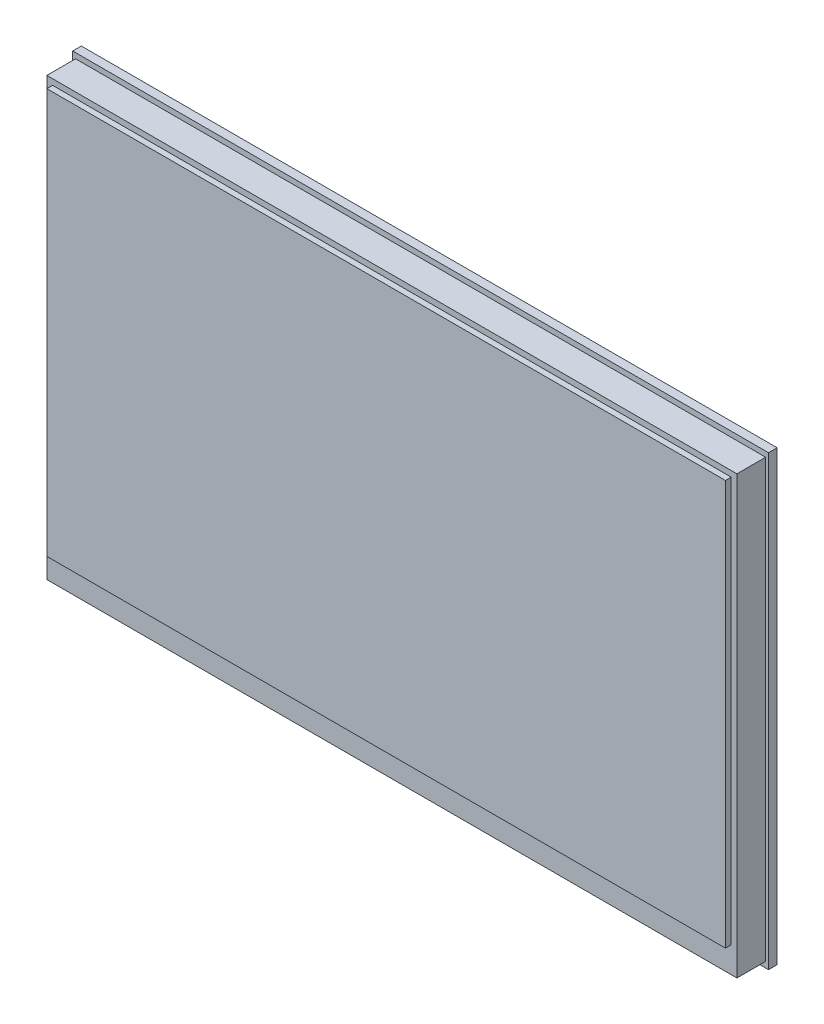
ISO-10303-21;
HEADER;
FILE_DESCRIPTION(('STEP AP214'),'2;1');
FILE_NAME('part.step','',(''),(''),'','','');
FILE_SCHEMA(('AUTOMOTIVE_DESIGN { 1 0 10303 214 1 1 1 1 }'));
ENDSEC;
DATA;
#1=APPLICATION_CONTEXT('core data for automotive mechanical design processes');
#2=APPLICATION_PROTOCOL_DEFINITION('international standard','automotive_design',2000,#1);
#3=PRODUCT_CONTEXT('',#1,'mechanical');
#4=PRODUCT('Part','Part','',(#3));
#5=PRODUCT_RELATED_PRODUCT_CATEGORY('part','',(#4));
#6=PRODUCT_DEFINITION_FORMATION('','',#4);
#7=PRODUCT_DEFINITION_CONTEXT('part definition',#1,'design');
#8=PRODUCT_DEFINITION('design','',#6,#7);
#9=PRODUCT_DEFINITION_SHAPE('','',#8);
#10=(LENGTH_UNIT() NAMED_UNIT(*) SI_UNIT(.MILLI.,.METRE.));
#11=(NAMED_UNIT(*) PLANE_ANGLE_UNIT() SI_UNIT($,.RADIAN.));
#12=(NAMED_UNIT(*) SI_UNIT($,.STERADIAN.) SOLID_ANGLE_UNIT());
#13=UNCERTAINTY_MEASURE_WITH_UNIT(LENGTH_MEASURE(1.E-05),#10,'distance_accuracy_value','');
#14=(GEOMETRIC_REPRESENTATION_CONTEXT(3) GLOBAL_UNCERTAINTY_ASSIGNED_CONTEXT((#13)) GLOBAL_UNIT_ASSIGNED_CONTEXT((#10,
#11,#12)) REPRESENTATION_CONTEXT('',''));
#15=CARTESIAN_POINT('',(0.,0.,0.));
#16=DIRECTION('',(0.,0.,1.));
#17=DIRECTION('',(1.,0.,0.));
#18=AXIS2_PLACEMENT_3D('',#15,#16,#17);
#19=CARTESIAN_POINT('',(0.,0.,6.5));
#20=DIRECTION('',(0.,0.,-1.));
#21=DIRECTION('',(-1.,0.,0.));
#22=AXIS2_PLACEMENT_3D('',#19,#20,#21);
#23=PLANE('',#22);
#24=DIRECTION('',(0.,-1.,0.));
#25=VECTOR('',#24,1.);
#26=CARTESIAN_POINT('',(0.5,1.,6.5));
#27=LINE('',#26,#25);
#28=CARTESIAN_POINT('',(0.5,77.,6.5));
#29=VERTEX_POINT('',#28);
#30=CARTESIAN_POINT('',(0.5,1.,6.5));
#31=VERTEX_POINT('',#30);
#32=EDGE_CURVE('E156',#29,#31,#27,.T.);
#33=ORIENTED_EDGE('',*,*,#32,.T.);
#34=DIRECTION('',(1.,0.,0.));
#35=VECTOR('',#34,1.);
#36=CARTESIAN_POINT('',(0.5,1.,6.5));
#37=LINE('',#36,#35);
#38=CARTESIAN_POINT('',(120.61,1.,6.5));
#39=VERTEX_POINT('',#38);
#40=EDGE_CURVE('E159',#31,#39,#37,.T.);
#41=ORIENTED_EDGE('',*,*,#40,.T.);
#42=DIRECTION('',(0.,1.,0.));
#43=VECTOR('',#42,1.);
#44=CARTESIAN_POINT('',(120.61,1.,6.5));
#45=LINE('',#44,#43);
#46=CARTESIAN_POINT('',(120.61,77.,6.5));
#47=VERTEX_POINT('',#46);
#48=EDGE_CURVE('E162',#39,#47,#45,.T.);
#49=ORIENTED_EDGE('',*,*,#48,.T.);
#50=DIRECTION('',(-1.,0.,0.));
#51=VECTOR('',#50,1.);
#52=CARTESIAN_POINT('',(0.5,77.,6.5));
#53=LINE('',#52,#51);
#54=EDGE_CURVE('E164',#47,#29,#53,.T.);
#55=ORIENTED_EDGE('',*,*,#54,.T.);
#56=EDGE_LOOP('',(#33,#41,#49,#55));
#57=FACE_BOUND('',#56,.T.);
#58=DIRECTION('',(0.,-1.,0.));
#59=VECTOR('',#58,1.);
#60=CARTESIAN_POINT('',(1.5,5.5,6.5));
#61=LINE('',#60,#59);
#62=CARTESIAN_POINT('',(1.5,76.,6.5));
#63=VERTEX_POINT('',#62);
#64=CARTESIAN_POINT('',(1.5,5.5,6.5));
#65=VERTEX_POINT('',#64);
#66=EDGE_CURVE('E146',#63,#65,#61,.T.);
#67=ORIENTED_EDGE('',*,*,#66,.F.);
#68=DIRECTION('',(-1.,0.,0.));
#69=VECTOR('',#68,1.);
#70=CARTESIAN_POINT('',(1.5,76.,6.5));
#71=LINE('',#70,#69);
#72=CARTESIAN_POINT('',(119.61,76.,6.5));
#73=VERTEX_POINT('',#72);
#74=EDGE_CURVE('E143',#73,#63,#71,.T.);
#75=ORIENTED_EDGE('',*,*,#74,.F.);
#76=DIRECTION('',(0.,1.,0.));
#77=VECTOR('',#76,1.);
#78=CARTESIAN_POINT('',(119.61,5.5,6.5));
#79=LINE('',#78,#77);
#80=CARTESIAN_POINT('',(119.61,5.5,6.5));
#81=VERTEX_POINT('',#80);
#82=EDGE_CURVE('E57',#81,#73,#79,.T.);
#83=ORIENTED_EDGE('',*,*,#82,.F.);
#84=DIRECTION('',(1.,0.,0.));
#85=VECTOR('',#84,1.);
#86=CARTESIAN_POINT('',(1.5,5.5,6.5));
#87=LINE('',#86,#85);
#88=EDGE_CURVE('E52',#65,#81,#87,.T.);
#89=ORIENTED_EDGE('',*,*,#88,.F.);
#90=EDGE_LOOP('',(#67,#75,#83,#89));
#91=FACE_BOUND('',#90,.T.);
#92=ADVANCED_FACE('F37',(#57,#91),#23,.F.);
#93=CARTESIAN_POINT('',(0.,0.,1.5));
#94=DIRECTION('',(0.,0.,-1.));
#95=DIRECTION('',(-1.,0.,0.));
#96=AXIS2_PLACEMENT_3D('',#93,#94,#95);
#97=PLANE('',#96);
#98=DIRECTION('',(0.,-1.,0.));
#99=VECTOR('',#98,1.);
#100=CARTESIAN_POINT('',(0.,0.,1.5));
#101=LINE('',#100,#99);
#102=CARTESIAN_POINT('',(0.,77.93,1.5));
#103=VERTEX_POINT('',#102);
#104=CARTESIAN_POINT('',(0.,0.,1.5));
#105=VERTEX_POINT('',#104);
#106=EDGE_CURVE('E210',#103,#105,#101,.T.);
#107=ORIENTED_EDGE('',*,*,#106,.T.);
#108=DIRECTION('',(1.,0.,0.));
#109=VECTOR('',#108,1.);
#110=CARTESIAN_POINT('',(0.,0.,1.5));
#111=LINE('',#110,#109);
#112=CARTESIAN_POINT('',(121.11,0.,1.5));
#113=VERTEX_POINT('',#112);
#114=EDGE_CURVE('E213',#105,#113,#111,.T.);
#115=ORIENTED_EDGE('',*,*,#114,.T.);
#116=DIRECTION('',(0.,1.,0.));
#117=VECTOR('',#116,1.);
#118=CARTESIAN_POINT('',(121.11,0.,1.5));
#119=LINE('',#118,#117);
#120=CARTESIAN_POINT('',(121.11,77.93,1.5));
#121=VERTEX_POINT('',#120);
#122=EDGE_CURVE('E216',#113,#121,#119,.T.);
#123=ORIENTED_EDGE('',*,*,#122,.T.);
#124=DIRECTION('',(-1.,0.,0.));
#125=VECTOR('',#124,1.);
#126=CARTESIAN_POINT('',(0.,77.93,1.5));
#127=LINE('',#126,#125);
#128=EDGE_CURVE('E218',#121,#103,#127,.T.);
#129=ORIENTED_EDGE('',*,*,#128,.T.);
#130=EDGE_LOOP('',(#107,#115,#123,#129));
#131=FACE_BOUND('',#130,.T.);
#132=DIRECTION('',(0.,-1.,0.));
#133=VECTOR('',#132,1.);
#134=CARTESIAN_POINT('',(0.5,1.,1.5));
#135=LINE('',#134,#133);
#136=CARTESIAN_POINT('',(0.5,77.,1.5));
#137=VERTEX_POINT('',#136);
#138=CARTESIAN_POINT('',(0.5,1.,1.5));
#139=VERTEX_POINT('',#138);
#140=EDGE_CURVE('E147',#137,#139,#135,.T.);
#141=ORIENTED_EDGE('',*,*,#140,.F.);
#142=DIRECTION('',(-1.,0.,0.));
#143=VECTOR('',#142,1.);
#144=CARTESIAN_POINT('',(0.5,77.,1.5));
#145=LINE('',#144,#143);
#146=CARTESIAN_POINT('',(120.61,77.,1.5));
#147=VERTEX_POINT('',#146);
#148=EDGE_CURVE('E160',#147,#137,#145,.T.);
#149=ORIENTED_EDGE('',*,*,#148,.F.);
#150=DIRECTION('',(0.,1.,0.));
#151=VECTOR('',#150,1.);
#152=CARTESIAN_POINT('',(120.61,1.,1.5));
#153=LINE('',#152,#151);
#154=CARTESIAN_POINT('',(120.61,1.,1.5));
#155=VERTEX_POINT('',#154);
#156=EDGE_CURVE('E169',#155,#147,#153,.T.);
#157=ORIENTED_EDGE('',*,*,#156,.F.);
#158=DIRECTION('',(1.,0.,0.));
#159=VECTOR('',#158,1.);
#160=CARTESIAN_POINT('',(0.5,1.,1.5));
#161=LINE('',#160,#159);
#162=EDGE_CURVE('E150',#139,#155,#161,.T.);
#163=ORIENTED_EDGE('',*,*,#162,.F.);
#164=EDGE_LOOP('',(#141,#149,#157,#163));
#165=FACE_BOUND('',#164,.T.);
#166=ADVANCED_FACE('F252',(#131,#165),#97,.F.);
#167=CARTESIAN_POINT('',(0.,0.,1.5));
#168=DIRECTION('',(1.,0.,0.));
#169=DIRECTION('',(0.,0.,-1.));
#170=AXIS2_PLACEMENT_3D('',#167,#168,#169);
#171=PLANE('',#170);
#172=DIRECTION('',(0.,-1.,0.));
#173=VECTOR('',#172,1.);
#174=CARTESIAN_POINT('',(0.,0.,0.));
#175=LINE('',#174,#173);
#176=CARTESIAN_POINT('',(0.,77.93,0.));
#177=VERTEX_POINT('',#176);
#178=CARTESIAN_POINT('',(0.,0.,0.));
#179=VERTEX_POINT('',#178);
#180=EDGE_CURVE('E209',#177,#179,#175,.T.);
#181=ORIENTED_EDGE('',*,*,#180,.T.);
#182=DIRECTION('',(0.,0.,-1.));
#183=VECTOR('',#182,1.);
#184=CARTESIAN_POINT('',(0.,0.,1.5));
#185=LINE('',#184,#183);
#186=EDGE_CURVE('E11',#105,#179,#185,.T.);
#187=ORIENTED_EDGE('',*,*,#186,.F.);
#188=ORIENTED_EDGE('',*,*,#106,.F.);
#189=DIRECTION('',(0.,0.,-1.));
#190=VECTOR('',#189,1.);
#191=CARTESIAN_POINT('',(0.,77.93,1.5));
#192=LINE('',#191,#190);
#193=EDGE_CURVE('E220',#103,#177,#192,.T.);
#194=ORIENTED_EDGE('',*,*,#193,.T.);
#195=EDGE_LOOP('',(#181,#187,#188,#194));
#196=FACE_BOUND('',#195,.T.);
#197=ADVANCED_FACE('F39',(#196),#171,.F.);
#198=CARTESIAN_POINT('',(0.,0.,1.5));
#199=DIRECTION('',(0.,1.,0.));
#200=DIRECTION('',(0.,0.,1.));
#201=AXIS2_PLACEMENT_3D('',#198,#199,#200);
#202=PLANE('',#201);
#203=DIRECTION('',(1.,0.,0.));
#204=VECTOR('',#203,1.);
#205=CARTESIAN_POINT('',(0.,0.,0.));
#206=LINE('',#205,#204);
#207=CARTESIAN_POINT('',(121.11,0.,0.));
#208=VERTEX_POINT('',#207);
#209=EDGE_CURVE('E223',#179,#208,#206,.T.);
#210=ORIENTED_EDGE('',*,*,#209,.T.);
#211=DIRECTION('',(0.,0.,-1.));
#212=VECTOR('',#211,1.);
#213=CARTESIAN_POINT('',(121.11,0.,1.5));
#214=LINE('',#213,#212);
#215=EDGE_CURVE('E45',#113,#208,#214,.T.);
#216=ORIENTED_EDGE('',*,*,#215,.F.);
#217=ORIENTED_EDGE('',*,*,#114,.F.);
#218=ORIENTED_EDGE('',*,*,#186,.T.);
#219=EDGE_LOOP('',(#210,#216,#217,#218));
#220=FACE_BOUND('',#219,.T.);
#221=ADVANCED_FACE('F254',(#220),#202,.F.);
#222=CARTESIAN_POINT('',(121.11,0.,1.5));
#223=DIRECTION('',(-1.,0.,0.));
#224=DIRECTION('',(0.,0.,1.));
#225=AXIS2_PLACEMENT_3D('',#222,#223,#224);
#226=PLANE('',#225);
#227=DIRECTION('',(0.,1.,0.));
#228=VECTOR('',#227,1.);
#229=CARTESIAN_POINT('',(121.11,0.,0.));
#230=LINE('',#229,#228);
#231=CARTESIAN_POINT('',(121.11,77.93,0.));
#232=VERTEX_POINT('',#231);
#233=EDGE_CURVE('E225',#208,#232,#230,.T.);
#234=ORIENTED_EDGE('',*,*,#233,.T.);
#235=DIRECTION('',(0.,0.,-1.));
#236=VECTOR('',#235,1.);
#237=CARTESIAN_POINT('',(121.11,77.93,1.5));
#238=LINE('',#237,#236);
#239=EDGE_CURVE('E230',#121,#232,#238,.T.);
#240=ORIENTED_EDGE('',*,*,#239,.F.);
#241=ORIENTED_EDGE('',*,*,#122,.F.);
#242=ORIENTED_EDGE('',*,*,#215,.T.);
#243=EDGE_LOOP('',(#234,#240,#241,#242));
#244=FACE_BOUND('',#243,.T.);
#245=ADVANCED_FACE('F237',(#244),#226,.F.);
#246=CARTESIAN_POINT('',(0.,77.93,1.5));
#247=DIRECTION('',(0.,-1.,0.));
#248=DIRECTION('',(0.,0.,-1.));
#249=AXIS2_PLACEMENT_3D('',#246,#247,#248);
#250=PLANE('',#249);
#251=DIRECTION('',(-1.,0.,0.));
#252=VECTOR('',#251,1.);
#253=CARTESIAN_POINT('',(0.,77.93,0.));
#254=LINE('',#253,#252);
#255=EDGE_CURVE('E214',#232,#177,#254,.T.);
#256=ORIENTED_EDGE('',*,*,#255,.T.);
#257=ORIENTED_EDGE('',*,*,#193,.F.);
#258=ORIENTED_EDGE('',*,*,#128,.F.);
#259=ORIENTED_EDGE('',*,*,#239,.T.);
#260=EDGE_LOOP('',(#256,#257,#258,#259));
#261=FACE_BOUND('',#260,.T.);
#262=ADVANCED_FACE('F246',(#261),#250,.F.);
#263=CARTESIAN_POINT('',(0.,0.,0.));
#264=DIRECTION('',(0.,0.,-1.));
#265=DIRECTION('',(-1.,0.,0.));
#266=AXIS2_PLACEMENT_3D('',#263,#264,#265);
#267=PLANE('',#266);
#268=CARTESIAN_POINT('',(23.02,74.29,0.));
#269=DIRECTION('',(0.,0.,1.));
#270=DIRECTION('',(1.,0.,0.));
#271=AXIS2_PLACEMENT_3D('',#268,#269,#270);
#272=CIRCLE('',#271,0.999999999999945);
#273=CARTESIAN_POINT('',(24.0199999999999,74.29,0.));
#274=VERTEX_POINT('',#273);
#275=EDGE_CURVE('E197',#274,#274,#272,.T.);
#276=ORIENTED_EDGE('',*,*,#275,.T.);
#277=EDGE_LOOP('',(#276));
#278=FACE_BOUND('',#277,.T.);
#279=CARTESIAN_POINT('',(23.02,5.,0.));
#280=DIRECTION('',(0.,0.,1.));
#281=DIRECTION('',(1.,0.,0.));
#282=AXIS2_PLACEMENT_3D('',#279,#280,#281);
#283=CIRCLE('',#282,0.999999999999945);
#284=CARTESIAN_POINT('',(24.0199999999999,5.,0.));
#285=VERTEX_POINT('',#284);
#286=EDGE_CURVE('E200',#285,#285,#283,.T.);
#287=ORIENTED_EDGE('',*,*,#286,.T.);
#288=EDGE_LOOP('',(#287));
#289=FACE_BOUND('',#288,.T.);
#290=CARTESIAN_POINT('',(116.11,74.29,0.));
#291=DIRECTION('',(0.,0.,1.));
#292=DIRECTION('',(1.,0.,0.));
#293=AXIS2_PLACEMENT_3D('',#290,#291,#292);
#294=CIRCLE('',#293,0.999999999999945);
#295=CARTESIAN_POINT('',(117.11,74.29,0.));
#296=VERTEX_POINT('',#295);
#297=EDGE_CURVE('E203',#296,#296,#294,.T.);
#298=ORIENTED_EDGE('',*,*,#297,.T.);
#299=EDGE_LOOP('',(#298));
#300=FACE_BOUND('',#299,.T.);
#301=CARTESIAN_POINT('',(116.11,5.,0.));
#302=DIRECTION('',(0.,0.,1.));
#303=DIRECTION('',(1.,0.,0.));
#304=AXIS2_PLACEMENT_3D('',#301,#302,#303);
#305=CIRCLE('',#304,0.999999999999945);
#306=CARTESIAN_POINT('',(117.11,5.,0.));
#307=VERTEX_POINT('',#306);
#308=EDGE_CURVE('E206',#307,#307,#305,.T.);
#309=ORIENTED_EDGE('',*,*,#308,.T.);
#310=EDGE_LOOP('',(#309));
#311=FACE_BOUND('',#310,.T.);
#312=ORIENTED_EDGE('',*,*,#180,.F.);
#313=ORIENTED_EDGE('',*,*,#255,.F.);
#314=ORIENTED_EDGE('',*,*,#233,.F.);
#315=ORIENTED_EDGE('',*,*,#209,.F.);
#316=EDGE_LOOP('',(#312,#313,#314,#315));
#317=FACE_BOUND('',#316,.T.);
#318=ADVANCED_FACE('F243',(#278,#289,#300,#311,#317),#267,.T.);
#319=CARTESIAN_POINT('',(116.11,5.,1.5));
#320=DIRECTION('',(0.,0.,1.));
#321=DIRECTION('',(1.,0.,0.));
#322=AXIS2_PLACEMENT_3D('',#319,#320,#321);
#323=CYLINDRICAL_SURFACE('',#322,0.999999999999945);
#324=ORIENTED_EDGE('',*,*,#308,.F.);
#325=EDGE_LOOP('',(#324));
#326=FACE_BOUND('',#325,.T.);
#327=CARTESIAN_POINT('',(116.11,5.,1.5));
#328=DIRECTION('',(0.,0.,-1.));
#329=DIRECTION('',(-1.,0.,0.));
#330=AXIS2_PLACEMENT_3D('',#327,#328,#329);
#331=CIRCLE('',#330,0.999999999999945);
#332=CARTESIAN_POINT('',(115.11,5.,1.5));
#333=VERTEX_POINT('',#332);
#334=EDGE_CURVE('E194',#333,#333,#331,.F.);
#335=ORIENTED_EDGE('',*,*,#334,.T.);
#336=EDGE_LOOP('',(#335));
#337=FACE_BOUND('',#336,.T.);
#338=ADVANCED_FACE('F304',(#326,#337),#323,.F.);
#339=CARTESIAN_POINT('',(116.11,74.29,1.5));
#340=DIRECTION('',(0.,0.,1.));
#341=DIRECTION('',(1.,0.,0.));
#342=AXIS2_PLACEMENT_3D('',#339,#340,#341);
#343=CYLINDRICAL_SURFACE('',#342,0.999999999999945);
#344=ORIENTED_EDGE('',*,*,#297,.F.);
#345=EDGE_LOOP('',(#344));
#346=FACE_BOUND('',#345,.T.);
#347=CARTESIAN_POINT('',(116.11,74.29,1.5));
#348=DIRECTION('',(0.,0.,-1.));
#349=DIRECTION('',(-1.,0.,0.));
#350=AXIS2_PLACEMENT_3D('',#347,#348,#349);
#351=CIRCLE('',#350,0.999999999999945);
#352=CARTESIAN_POINT('',(115.11,74.29,1.5));
#353=VERTEX_POINT('',#352);
#354=EDGE_CURVE('E191',#353,#353,#351,.F.);
#355=ORIENTED_EDGE('',*,*,#354,.T.);
#356=EDGE_LOOP('',(#355));
#357=FACE_BOUND('',#356,.T.);
#358=ADVANCED_FACE('F300',(#346,#357),#343,.F.);
#359=CARTESIAN_POINT('',(23.02,5.,1.5));
#360=DIRECTION('',(0.,0.,1.));
#361=DIRECTION('',(1.,0.,0.));
#362=AXIS2_PLACEMENT_3D('',#359,#360,#361);
#363=CYLINDRICAL_SURFACE('',#362,0.999999999999945);
#364=ORIENTED_EDGE('',*,*,#286,.F.);
#365=EDGE_LOOP('',(#364));
#366=FACE_BOUND('',#365,.T.);
#367=CARTESIAN_POINT('',(23.02,5.,1.5));
#368=DIRECTION('',(0.,0.,-1.));
#369=DIRECTION('',(-1.,0.,0.));
#370=AXIS2_PLACEMENT_3D('',#367,#368,#369);
#371=CIRCLE('',#370,0.999999999999945);
#372=CARTESIAN_POINT('',(22.02,5.,1.5));
#373=VERTEX_POINT('',#372);
#374=EDGE_CURVE('E188',#373,#373,#371,.F.);
#375=ORIENTED_EDGE('',*,*,#374,.T.);
#376=EDGE_LOOP('',(#375));
#377=FACE_BOUND('',#376,.T.);
#378=ADVANCED_FACE('F296',(#366,#377),#363,.F.);
#379=CARTESIAN_POINT('',(23.02,74.29,1.5));
#380=DIRECTION('',(0.,0.,1.));
#381=DIRECTION('',(1.,0.,0.));
#382=AXIS2_PLACEMENT_3D('',#379,#380,#381);
#383=CYLINDRICAL_SURFACE('',#382,0.999999999999945);
#384=ORIENTED_EDGE('',*,*,#275,.F.);
#385=EDGE_LOOP('',(#384));
#386=FACE_BOUND('',#385,.T.);
#387=CARTESIAN_POINT('',(23.02,74.29,1.5));
#388=DIRECTION('',(0.,0.,-1.));
#389=DIRECTION('',(-1.,0.,0.));
#390=AXIS2_PLACEMENT_3D('',#387,#388,#389);
#391=CIRCLE('',#390,0.999999999999945);
#392=CARTESIAN_POINT('',(22.02,74.29,1.5));
#393=VERTEX_POINT('',#392);
#394=EDGE_CURVE('E185',#393,#393,#391,.F.);
#395=ORIENTED_EDGE('',*,*,#394,.T.);
#396=EDGE_LOOP('',(#395));
#397=FACE_BOUND('',#396,.T.);
#398=ADVANCED_FACE('F293',(#386,#397),#383,.F.);
#399=CARTESIAN_POINT('',(0.,0.,1.5));
#400=DIRECTION('',(0.,0.,-1.));
#401=DIRECTION('',(-1.,0.,0.));
#402=AXIS2_PLACEMENT_3D('',#399,#400,#401);
#403=PLANE('',#402);
#404=ORIENTED_EDGE('',*,*,#394,.F.);
#405=EDGE_LOOP('',(#404));
#406=FACE_BOUND('',#405,.T.);
#407=ADVANCED_FACE('F277',(#406),#403,.T.);
#408=ORIENTED_EDGE('',*,*,#374,.F.);
#409=EDGE_LOOP('',(#408));
#410=FACE_BOUND('',#409,.T.);
#411=ADVANCED_FACE('F344',(#410),#403,.T.);
#412=ORIENTED_EDGE('',*,*,#354,.F.);
#413=EDGE_LOOP('',(#412));
#414=FACE_BOUND('',#413,.T.);
#415=ADVANCED_FACE('F275',(#414),#403,.T.);
#416=ORIENTED_EDGE('',*,*,#334,.F.);
#417=EDGE_LOOP('',(#416));
#418=FACE_BOUND('',#417,.T.);
#419=ADVANCED_FACE('F271',(#418),#403,.T.);
#420=CARTESIAN_POINT('',(0.5,1.,6.5));
#421=DIRECTION('',(1.,0.,0.));
#422=DIRECTION('',(0.,0.,-1.));
#423=AXIS2_PLACEMENT_3D('',#420,#421,#422);
#424=PLANE('',#423);
#425=ORIENTED_EDGE('',*,*,#140,.T.);
#426=DIRECTION('',(0.,0.,-1.));
#427=VECTOR('',#426,1.);
#428=CARTESIAN_POINT('',(0.5,1.,6.5));
#429=LINE('',#428,#427);
#430=EDGE_CURVE('E182',#31,#139,#429,.T.);
#431=ORIENTED_EDGE('',*,*,#430,.F.);
#432=ORIENTED_EDGE('',*,*,#32,.F.);
#433=DIRECTION('',(0.,0.,-1.));
#434=VECTOR('',#433,1.);
#435=CARTESIAN_POINT('',(0.5,77.,6.5));
#436=LINE('',#435,#434);
#437=EDGE_CURVE('E165',#29,#137,#436,.T.);
#438=ORIENTED_EDGE('',*,*,#437,.T.);
#439=EDGE_LOOP('',(#425,#431,#432,#438));
#440=FACE_BOUND('',#439,.T.);
#441=ADVANCED_FACE('F274',(#440),#424,.F.);
#442=CARTESIAN_POINT('',(0.5,1.,6.5));
#443=DIRECTION('',(0.,1.,0.));
#444=DIRECTION('',(0.,0.,1.));
#445=AXIS2_PLACEMENT_3D('',#442,#443,#444);
#446=PLANE('',#445);
#447=ORIENTED_EDGE('',*,*,#162,.T.);
#448=DIRECTION('',(0.,0.,-1.));
#449=VECTOR('',#448,1.);
#450=CARTESIAN_POINT('',(120.61,1.,6.5));
#451=LINE('',#450,#449);
#452=EDGE_CURVE('E179',#39,#155,#451,.T.);
#453=ORIENTED_EDGE('',*,*,#452,.F.);
#454=ORIENTED_EDGE('',*,*,#40,.F.);
#455=ORIENTED_EDGE('',*,*,#430,.T.);
#456=EDGE_LOOP('',(#447,#453,#454,#455));
#457=FACE_BOUND('',#456,.T.);
#458=ADVANCED_FACE('F285',(#457),#446,.F.);
#459=CARTESIAN_POINT('',(120.61,1.,6.5));
#460=DIRECTION('',(-1.,0.,0.));
#461=DIRECTION('',(0.,0.,1.));
#462=AXIS2_PLACEMENT_3D('',#459,#460,#461);
#463=PLANE('',#462);
#464=ORIENTED_EDGE('',*,*,#156,.T.);
#465=DIRECTION('',(0.,0.,-1.));
#466=VECTOR('',#465,1.);
#467=CARTESIAN_POINT('',(120.61,77.,6.5));
#468=LINE('',#467,#466);
#469=EDGE_CURVE('E176',#47,#147,#468,.T.);
#470=ORIENTED_EDGE('',*,*,#469,.F.);
#471=ORIENTED_EDGE('',*,*,#48,.F.);
#472=ORIENTED_EDGE('',*,*,#452,.T.);
#473=EDGE_LOOP('',(#464,#470,#471,#472));
#474=FACE_BOUND('',#473,.T.);
#475=ADVANCED_FACE('F281',(#474),#463,.F.);
#476=CARTESIAN_POINT('',(0.5,77.,6.5));
#477=DIRECTION('',(0.,-1.,0.));
#478=DIRECTION('',(0.,0.,-1.));
#479=AXIS2_PLACEMENT_3D('',#476,#477,#478);
#480=PLANE('',#479);
#481=ORIENTED_EDGE('',*,*,#148,.T.);
#482=ORIENTED_EDGE('',*,*,#437,.F.);
#483=ORIENTED_EDGE('',*,*,#54,.F.);
#484=ORIENTED_EDGE('',*,*,#469,.T.);
#485=EDGE_LOOP('',(#481,#482,#483,#484));
#486=FACE_BOUND('',#485,.T.);
#487=ADVANCED_FACE('F278',(#486),#480,.F.);
#488=CARTESIAN_POINT('',(1.5,5.5,7.5));
#489=DIRECTION('',(1.,0.,0.));
#490=DIRECTION('',(0.,0.,-1.));
#491=AXIS2_PLACEMENT_3D('',#488,#489,#490);
#492=PLANE('',#491);
#493=ORIENTED_EDGE('',*,*,#66,.T.);
#494=DIRECTION('',(0.,0.,-1.));
#495=VECTOR('',#494,1.);
#496=CARTESIAN_POINT('',(1.5,5.5,7.5));
#497=LINE('',#496,#495);
#498=CARTESIAN_POINT('',(1.5,5.5,7.5));
#499=VERTEX_POINT('',#498);
#500=EDGE_CURVE('E127',#499,#65,#497,.T.);
#501=ORIENTED_EDGE('',*,*,#500,.F.);
#502=DIRECTION('',(0.,-1.,0.));
#503=VECTOR('',#502,1.);
#504=CARTESIAN_POINT('',(1.5,5.5,7.5));
#505=LINE('',#504,#503);
#506=CARTESIAN_POINT('',(1.5,76.,7.5));
#507=VERTEX_POINT('',#506);
#508=EDGE_CURVE('E134',#507,#499,#505,.T.);
#509=ORIENTED_EDGE('',*,*,#508,.F.);
#510=DIRECTION('',(0.,0.,-1.));
#511=VECTOR('',#510,1.);
#512=CARTESIAN_POINT('',(1.5,76.,7.5));
#513=LINE('',#512,#511);
#514=EDGE_CURVE('E494',#507,#63,#513,.T.);
#515=ORIENTED_EDGE('',*,*,#514,.T.);
#516=EDGE_LOOP('',(#493,#501,#509,#515));
#517=FACE_BOUND('',#516,.T.);
#518=ADVANCED_FACE('F145',(#517),#492,.F.);
#519=CARTESIAN_POINT('',(1.5,5.5,7.5));
#520=DIRECTION('',(0.,1.,0.));
#521=DIRECTION('',(0.,0.,1.));
#522=AXIS2_PLACEMENT_3D('',#519,#520,#521);
#523=PLANE('',#522);
#524=ORIENTED_EDGE('',*,*,#88,.T.);
#525=DIRECTION('',(0.,0.,-1.));
#526=VECTOR('',#525,1.);
#527=CARTESIAN_POINT('',(119.61,5.5,7.5));
#528=LINE('',#527,#526);
#529=CARTESIAN_POINT('',(119.61,5.5,7.5));
#530=VERTEX_POINT('',#529);
#531=EDGE_CURVE('E130',#530,#81,#528,.T.);
#532=ORIENTED_EDGE('',*,*,#531,.F.);
#533=DIRECTION('',(1.,0.,0.));
#534=VECTOR('',#533,1.);
#535=CARTESIAN_POINT('',(1.5,5.5,7.5));
#536=LINE('',#535,#534);
#537=EDGE_CURVE('E123',#499,#530,#536,.T.);
#538=ORIENTED_EDGE('',*,*,#537,.F.);
#539=ORIENTED_EDGE('',*,*,#500,.T.);
#540=EDGE_LOOP('',(#524,#532,#538,#539));
#541=FACE_BOUND('',#540,.T.);
#542=ADVANCED_FACE('F125',(#541),#523,.F.);
#543=CARTESIAN_POINT('',(119.61,5.5,7.5));
#544=DIRECTION('',(-1.,0.,0.));
#545=DIRECTION('',(0.,0.,1.));
#546=AXIS2_PLACEMENT_3D('',#543,#544,#545);
#547=PLANE('',#546);
#548=ORIENTED_EDGE('',*,*,#82,.T.);
#549=DIRECTION('',(0.,0.,-1.));
#550=VECTOR('',#549,1.);
#551=CARTESIAN_POINT('',(119.61,76.,7.5));
#552=LINE('',#551,#550);
#553=CARTESIAN_POINT('',(119.61,76.,7.5));
#554=VERTEX_POINT('',#553);
#555=EDGE_CURVE('E152',#554,#73,#552,.T.);
#556=ORIENTED_EDGE('',*,*,#555,.F.);
#557=DIRECTION('',(0.,1.,0.));
#558=VECTOR('',#557,1.);
#559=CARTESIAN_POINT('',(119.61,5.5,7.5));
#560=LINE('',#559,#558);
#561=EDGE_CURVE('E133',#530,#554,#560,.T.);
#562=ORIENTED_EDGE('',*,*,#561,.F.);
#563=ORIENTED_EDGE('',*,*,#531,.T.);
#564=EDGE_LOOP('',(#548,#556,#562,#563));
#565=FACE_BOUND('',#564,.T.);
#566=ADVANCED_FACE('F388',(#565),#547,.F.);
#567=CARTESIAN_POINT('',(1.5,76.,7.5));
#568=DIRECTION('',(0.,-1.,0.));
#569=DIRECTION('',(0.,0.,-1.));
#570=AXIS2_PLACEMENT_3D('',#567,#568,#569);
#571=PLANE('',#570);
#572=ORIENTED_EDGE('',*,*,#74,.T.);
#573=ORIENTED_EDGE('',*,*,#514,.F.);
#574=DIRECTION('',(-1.,0.,0.));
#575=VECTOR('',#574,1.);
#576=CARTESIAN_POINT('',(1.5,76.,7.5));
#577=LINE('',#576,#575);
#578=EDGE_CURVE('E139',#554,#507,#577,.T.);
#579=ORIENTED_EDGE('',*,*,#578,.F.);
#580=ORIENTED_EDGE('',*,*,#555,.T.);
#581=EDGE_LOOP('',(#572,#573,#579,#580));
#582=FACE_BOUND('',#581,.T.);
#583=ADVANCED_FACE('F394',(#582),#571,.F.);
#584=CARTESIAN_POINT('',(0.,0.,7.5));
#585=DIRECTION('',(0.,0.,-1.));
#586=DIRECTION('',(-1.,0.,0.));
#587=AXIS2_PLACEMENT_3D('',#584,#585,#586);
#588=PLANE('',#587);
#589=ORIENTED_EDGE('',*,*,#508,.T.);
#590=ORIENTED_EDGE('',*,*,#537,.T.);
#591=ORIENTED_EDGE('',*,*,#561,.T.);
#592=ORIENTED_EDGE('',*,*,#578,.T.);
#593=EDGE_LOOP('',(#589,#590,#591,#592));
#594=FACE_BOUND('',#593,.T.);
#595=ADVANCED_FACE('F137',(#594),#588,.F.);
#596=CLOSED_SHELL('',(#92,#166,#197,#221,#245,#262,#318,#338,#358,#378,#398,#407,#411,#415,#419,
#441,#458,#475,#487,#518,#542,#566,#583,#595));
#597=MANIFOLD_SOLID_BREP('B2',#596);
#598=ADVANCED_BREP_SHAPE_REPRESENTATION('',(#18,#597),#14);
#599=SHAPE_DEFINITION_REPRESENTATION(#9,#598);
ENDSEC;
END-ISO-10303-21;
